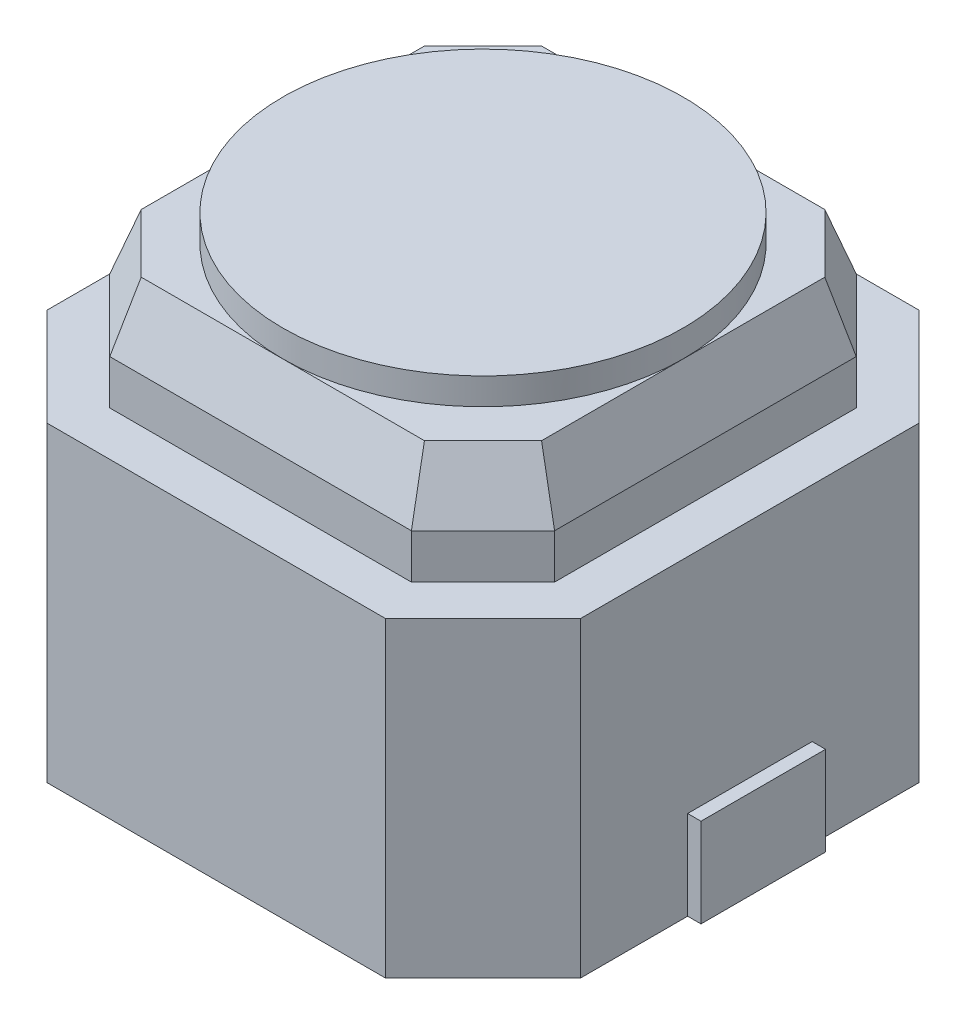
ISO-10303-21;
HEADER;
FILE_DESCRIPTION(('STEP AP214'),'2;1');
FILE_NAME('part.step','',(''),(''),'','','');
FILE_SCHEMA(('AUTOMOTIVE_DESIGN { 1 0 10303 214 1 1 1 1 }'));
ENDSEC;
DATA;
#1=APPLICATION_CONTEXT('core data for automotive mechanical design processes');
#2=APPLICATION_PROTOCOL_DEFINITION('international standard','automotive_design',2000,#1);
#3=PRODUCT_CONTEXT('',#1,'mechanical');
#4=PRODUCT('Part','Part','',(#3));
#5=PRODUCT_RELATED_PRODUCT_CATEGORY('part','',(#4));
#6=PRODUCT_DEFINITION_FORMATION('','',#4);
#7=PRODUCT_DEFINITION_CONTEXT('part definition',#1,'design');
#8=PRODUCT_DEFINITION('design','',#6,#7);
#9=PRODUCT_DEFINITION_SHAPE('','',#8);
#10=(LENGTH_UNIT() NAMED_UNIT(*) SI_UNIT(.MILLI.,.METRE.));
#11=(NAMED_UNIT(*) PLANE_ANGLE_UNIT() SI_UNIT($,.RADIAN.));
#12=(NAMED_UNIT(*) SI_UNIT($,.STERADIAN.) SOLID_ANGLE_UNIT());
#13=UNCERTAINTY_MEASURE_WITH_UNIT(LENGTH_MEASURE(1.E-05),#10,'distance_accuracy_value','');
#14=(GEOMETRIC_REPRESENTATION_CONTEXT(3) GLOBAL_UNCERTAINTY_ASSIGNED_CONTEXT((#13)) GLOBAL_UNIT_ASSIGNED_CONTEXT((#10,
#11,#12)) REPRESENTATION_CONTEXT('',''));
#15=CARTESIAN_POINT('',(0.,0.,0.));
#16=DIRECTION('',(0.,0.,1.));
#17=DIRECTION('',(1.,0.,0.));
#18=AXIS2_PLACEMENT_3D('',#15,#16,#17);
#19=CARTESIAN_POINT('',(0.,3.5,-4.90246392100625));
#20=DIRECTION('',(1.,0.,0.));
#21=DIRECTION('',(0.,0.,-1.));
#22=AXIS2_PLACEMENT_3D('',#19,#20,#21);
#23=PLANE('',#22);
#24=DIRECTION('',(0.,-1.,0.));
#25=VECTOR('',#24,1.);
#26=CARTESIAN_POINT('',(0.,1.,-3.7));
#27=LINE('',#26,#25);
#28=CARTESIAN_POINT('',(0.,1.,-3.7));
#29=VERTEX_POINT('',#28);
#30=CARTESIAN_POINT('',(0.,0.,-3.7));
#31=VERTEX_POINT('',#30);
#32=EDGE_CURVE('E282',#29,#31,#27,.T.);
#33=ORIENTED_EDGE('',*,*,#32,.F.);
#34=DIRECTION('',(0.,0.,1.));
#35=VECTOR('',#34,1.);
#36=CARTESIAN_POINT('',(0.,1.,-3.7));
#37=LINE('',#36,#35);
#38=CARTESIAN_POINT('',(0.,1.,-2.3));
#39=VERTEX_POINT('',#38);
#40=EDGE_CURVE('E275',#29,#39,#37,.T.);
#41=ORIENTED_EDGE('',*,*,#40,.T.);
#42=DIRECTION('',(0.,-1.,0.));
#43=VECTOR('',#42,1.);
#44=CARTESIAN_POINT('',(0.,1.,-2.3));
#45=LINE('',#44,#43);
#46=CARTESIAN_POINT('',(0.,0.,-2.3));
#47=VERTEX_POINT('',#46);
#48=EDGE_CURVE('E261',#39,#47,#45,.T.);
#49=ORIENTED_EDGE('',*,*,#48,.T.);
#50=DIRECTION('',(0.,0.,1.));
#51=VECTOR('',#50,1.);
#52=CARTESIAN_POINT('',(0.,0.,-4.90246392100625));
#53=LINE('',#52,#51);
#54=CARTESIAN_POINT('',(0.,0.,-1.09753607899375));
#55=VERTEX_POINT('',#54);
#56=EDGE_CURVE('E879',#47,#55,#53,.T.);
#57=ORIENTED_EDGE('',*,*,#56,.T.);
#58=DIRECTION('',(0.,-1.,0.));
#59=VECTOR('',#58,1.);
#60=CARTESIAN_POINT('',(0.,3.5,-1.09753607899375));
#61=LINE('',#60,#59);
#62=CARTESIAN_POINT('',(0.,3.5,-1.09753607899375));
#63=VERTEX_POINT('',#62);
#64=EDGE_CURVE('E885',#63,#55,#61,.T.);
#65=ORIENTED_EDGE('',*,*,#64,.F.);
#66=DIRECTION('',(0.,0.,1.));
#67=VECTOR('',#66,1.);
#68=CARTESIAN_POINT('',(0.,3.5,-4.90246392100625));
#69=LINE('',#68,#67);
#70=CARTESIAN_POINT('',(0.,3.5,-4.90246392100625));
#71=VERTEX_POINT('',#70);
#72=EDGE_CURVE('E884',#71,#63,#69,.T.);
#73=ORIENTED_EDGE('',*,*,#72,.F.);
#74=DIRECTION('',(0.,-1.,0.));
#75=VECTOR('',#74,1.);
#76=CARTESIAN_POINT('',(0.,3.5,-4.90246392100625));
#77=LINE('',#76,#75);
#78=CARTESIAN_POINT('',(0.,0.,-4.90246392100625));
#79=VERTEX_POINT('',#78);
#80=EDGE_CURVE('E871',#71,#79,#77,.T.);
#81=ORIENTED_EDGE('',*,*,#80,.T.);
#82=EDGE_CURVE('E882',#79,#31,#53,.T.);
#83=ORIENTED_EDGE('',*,*,#82,.T.);
#84=EDGE_LOOP('',(#33,#41,#49,#57,#65,#73,#81,#83));
#85=FACE_BOUND('',#84,.T.);
#86=ADVANCED_FACE('F52',(#85),#23,.F.);
#87=CARTESIAN_POINT('',(6.,3.5,-4.90246392100625));
#88=DIRECTION('',(-1.,0.,0.));
#89=DIRECTION('',(0.,0.,1.));
#90=AXIS2_PLACEMENT_3D('',#87,#88,#89);
#91=PLANE('',#90);
#92=DIRECTION('',(0.,-1.,0.));
#93=VECTOR('',#92,1.);
#94=CARTESIAN_POINT('',(6.,1.,-2.3));
#95=LINE('',#94,#93);
#96=CARTESIAN_POINT('',(6.,1.,-2.3));
#97=VERTEX_POINT('',#96);
#98=CARTESIAN_POINT('',(6.,0.,-2.3));
#99=VERTEX_POINT('',#98);
#100=EDGE_CURVE('E312',#97,#99,#95,.T.);
#101=ORIENTED_EDGE('',*,*,#100,.F.);
#102=DIRECTION('',(0.,0.,-1.));
#103=VECTOR('',#102,1.);
#104=CARTESIAN_POINT('',(6.,1.,-3.));
#105=LINE('',#104,#103);
#106=CARTESIAN_POINT('',(6.,1.,-3.7));
#107=VERTEX_POINT('',#106);
#108=EDGE_CURVE('E302',#97,#107,#105,.T.);
#109=ORIENTED_EDGE('',*,*,#108,.T.);
#110=DIRECTION('',(0.,-1.,0.));
#111=VECTOR('',#110,1.);
#112=CARTESIAN_POINT('',(6.,1.,-3.7));
#113=LINE('',#112,#111);
#114=CARTESIAN_POINT('',(6.,0.,-3.7));
#115=VERTEX_POINT('',#114);
#116=EDGE_CURVE('E323',#107,#115,#113,.T.);
#117=ORIENTED_EDGE('',*,*,#116,.T.);
#118=DIRECTION('',(0.,0.,-1.));
#119=VECTOR('',#118,1.);
#120=CARTESIAN_POINT('',(6.,0.,-4.90246392100625));
#121=LINE('',#120,#119);
#122=CARTESIAN_POINT('',(6.,0.,-4.90246392100625));
#123=VERTEX_POINT('',#122);
#124=EDGE_CURVE('E898',#115,#123,#121,.T.);
#125=ORIENTED_EDGE('',*,*,#124,.T.);
#126=DIRECTION('',(0.,-1.,0.));
#127=VECTOR('',#126,1.);
#128=CARTESIAN_POINT('',(6.,3.5,-4.90246392100625));
#129=LINE('',#128,#127);
#130=CARTESIAN_POINT('',(6.,3.5,-4.90246392100625));
#131=VERTEX_POINT('',#130);
#132=EDGE_CURVE('E905',#131,#123,#129,.T.);
#133=ORIENTED_EDGE('',*,*,#132,.F.);
#134=DIRECTION('',(0.,0.,-1.));
#135=VECTOR('',#134,1.);
#136=CARTESIAN_POINT('',(6.,3.5,-4.90246392100625));
#137=LINE('',#136,#135);
#138=CARTESIAN_POINT('',(6.,3.5,-1.09753607899375));
#139=VERTEX_POINT('',#138);
#140=EDGE_CURVE('E909',#139,#131,#137,.T.);
#141=ORIENTED_EDGE('',*,*,#140,.F.);
#142=DIRECTION('',(0.,-1.,0.));
#143=VECTOR('',#142,1.);
#144=CARTESIAN_POINT('',(6.,3.5,-1.09753607899375));
#145=LINE('',#144,#143);
#146=CARTESIAN_POINT('',(6.,0.,-1.09753607899375));
#147=VERTEX_POINT('',#146);
#148=EDGE_CURVE('E908',#139,#147,#145,.T.);
#149=ORIENTED_EDGE('',*,*,#148,.T.);
#150=EDGE_CURVE('E899',#147,#99,#121,.T.);
#151=ORIENTED_EDGE('',*,*,#150,.T.);
#152=EDGE_LOOP('',(#101,#109,#117,#125,#133,#141,#149,#151));
#153=FACE_BOUND('',#152,.T.);
#154=ADVANCED_FACE('F846',(#153),#91,.F.);
#155=CARTESIAN_POINT('',(0.,3.5,0.));
#156=DIRECTION('',(0.,-1.,0.));
#157=DIRECTION('',(0.,0.,-1.));
#158=AXIS2_PLACEMENT_3D('',#155,#156,#157);
#159=PLANE('',#158);
#160=DIRECTION('',(-0.707106781186548,0.,-0.707106781186548));
#161=VECTOR('',#160,1.);
#162=CARTESIAN_POINT('',(5.45,3.5,-5.45246392100625));
#163=LINE('',#162,#161);
#164=CARTESIAN_POINT('',(4.90246392100625,3.5,-6.));
#165=VERTEX_POINT('',#164);
#166=EDGE_CURVE('E904',#131,#165,#163,.T.);
#167=ORIENTED_EDGE('',*,*,#166,.T.);
#168=DIRECTION('',(-1.,0.,0.));
#169=VECTOR('',#168,1.);
#170=CARTESIAN_POINT('',(4.90246392100625,3.5,-6.));
#171=LINE('',#170,#169);
#172=CARTESIAN_POINT('',(1.09753607899375,3.5,-6.));
#173=VERTEX_POINT('',#172);
#174=EDGE_CURVE('E922',#165,#173,#171,.T.);
#175=ORIENTED_EDGE('',*,*,#174,.T.);
#176=DIRECTION('',(-0.707106781186548,0.,0.707106781186547));
#177=VECTOR('',#176,1.);
#178=CARTESIAN_POINT('',(0.549999999999998,3.5,-5.45246392100625));
#179=LINE('',#178,#177);
#180=EDGE_CURVE('E939',#173,#71,#179,.T.);
#181=ORIENTED_EDGE('',*,*,#180,.T.);
#182=ORIENTED_EDGE('',*,*,#72,.T.);
#183=DIRECTION('',(0.707106781186548,0.,0.707106781186547));
#184=VECTOR('',#183,1.);
#185=CARTESIAN_POINT('',(0.549999999999998,3.5,-0.547536078993751));
#186=LINE('',#185,#184);
#187=CARTESIAN_POINT('',(1.09753607899375,3.5,0.));
#188=VERTEX_POINT('',#187);
#189=EDGE_CURVE('E936',#63,#188,#186,.T.);
#190=ORIENTED_EDGE('',*,*,#189,.T.);
#191=DIRECTION('',(1.,0.,0.));
#192=VECTOR('',#191,1.);
#193=CARTESIAN_POINT('',(1.09753607899375,3.5,0.));
#194=LINE('',#193,#192);
#195=CARTESIAN_POINT('',(4.90246392100625,3.5,0.));
#196=VERTEX_POINT('',#195);
#197=EDGE_CURVE('E934',#188,#196,#194,.T.);
#198=ORIENTED_EDGE('',*,*,#197,.T.);
#199=DIRECTION('',(0.707106781186548,0.,-0.707106781186548));
#200=VECTOR('',#199,1.);
#201=CARTESIAN_POINT('',(5.45,3.5,-0.54753607899375));
#202=LINE('',#201,#200);
#203=EDGE_CURVE('E932',#196,#139,#202,.T.);
#204=ORIENTED_EDGE('',*,*,#203,.T.);
#205=ORIENTED_EDGE('',*,*,#140,.T.);
#206=EDGE_LOOP('',(#167,#175,#181,#182,#190,#198,#204,#205));
#207=FACE_BOUND('',#206,.T.);
#208=DIRECTION('',(-0.707106781186548,0.,0.707106781186548));
#209=VECTOR('',#208,1.);
#210=CARTESIAN_POINT('',(0.5,3.5,-4.6953571398197));
#211=LINE('',#210,#209);
#212=CARTESIAN_POINT('',(1.3046428601803,3.5,-5.5));
#213=VERTEX_POINT('',#212);
#214=CARTESIAN_POINT('',(0.5,3.5,-4.6953571398197));
#215=VERTEX_POINT('',#214);
#216=EDGE_CURVE('E392',#213,#215,#211,.T.);
#217=ORIENTED_EDGE('',*,*,#216,.F.);
#218=DIRECTION('',(-1.,0.,0.));
#219=VECTOR('',#218,1.);
#220=CARTESIAN_POINT('',(1.3046428601803,3.5,-5.5));
#221=LINE('',#220,#219);
#222=CARTESIAN_POINT('',(4.6953571398197,3.5,-5.5));
#223=VERTEX_POINT('',#222);
#224=EDGE_CURVE('E943',#223,#213,#221,.T.);
#225=ORIENTED_EDGE('',*,*,#224,.F.);
#226=DIRECTION('',(-0.707106781186547,0.,-0.707106781186547));
#227=VECTOR('',#226,1.);
#228=CARTESIAN_POINT('',(4.6953571398197,3.5,-5.5));
#229=LINE('',#228,#227);
#230=CARTESIAN_POINT('',(5.5,3.5,-4.6953571398197));
#231=VERTEX_POINT('',#230);
#232=EDGE_CURVE('E946',#231,#223,#229,.T.);
#233=ORIENTED_EDGE('',*,*,#232,.F.);
#234=DIRECTION('',(0.,0.,-1.));
#235=VECTOR('',#234,1.);
#236=CARTESIAN_POINT('',(5.5,3.5,-4.6953571398197));
#237=LINE('',#236,#235);
#238=CARTESIAN_POINT('',(5.5,3.5,-1.3046428601803));
#239=VERTEX_POINT('',#238);
#240=EDGE_CURVE('E949',#239,#231,#237,.T.);
#241=ORIENTED_EDGE('',*,*,#240,.F.);
#242=DIRECTION('',(0.707106781186547,0.,-0.707106781186547));
#243=VECTOR('',#242,1.);
#244=CARTESIAN_POINT('',(5.5,3.5,-1.3046428601803));
#245=LINE('',#244,#243);
#246=CARTESIAN_POINT('',(4.6953571398197,3.5,-0.499999999999999));
#247=VERTEX_POINT('',#246);
#248=EDGE_CURVE('E952',#247,#239,#245,.T.);
#249=ORIENTED_EDGE('',*,*,#248,.F.);
#250=DIRECTION('',(1.,0.,0.));
#251=VECTOR('',#250,1.);
#252=CARTESIAN_POINT('',(4.6953571398197,3.5,-0.499999999999999));
#253=LINE('',#252,#251);
#254=CARTESIAN_POINT('',(1.3046428601803,3.5,-0.499999999999999));
#255=VERTEX_POINT('',#254);
#256=EDGE_CURVE('E955',#255,#247,#253,.T.);
#257=ORIENTED_EDGE('',*,*,#256,.F.);
#258=DIRECTION('',(0.707106781186548,0.,0.707106781186548));
#259=VECTOR('',#258,1.);
#260=CARTESIAN_POINT('',(1.3046428601803,3.5,-0.499999999999999));
#261=LINE('',#260,#259);
#262=CARTESIAN_POINT('',(0.5,3.5,-1.3046428601803));
#263=VERTEX_POINT('',#262);
#264=EDGE_CURVE('E958',#263,#255,#261,.T.);
#265=ORIENTED_EDGE('',*,*,#264,.F.);
#266=DIRECTION('',(0.,0.,1.));
#267=VECTOR('',#266,1.);
#268=CARTESIAN_POINT('',(0.5,3.5,-1.3046428601803));
#269=LINE('',#268,#267);
#270=EDGE_CURVE('E960',#215,#263,#269,.T.);
#271=ORIENTED_EDGE('',*,*,#270,.F.);
#272=EDGE_LOOP('',(#217,#225,#233,#241,#249,#257,#265,#271));
#273=FACE_BOUND('',#272,.T.);
#274=ADVANCED_FACE('F611',(#207,#273),#159,.F.);
#275=CARTESIAN_POINT('',(4.90246392100625,3.5,-6.));
#276=DIRECTION('',(0.,0.,1.));
#277=DIRECTION('',(1.,0.,0.));
#278=AXIS2_PLACEMENT_3D('',#275,#276,#277);
#279=PLANE('',#278);
#280=DIRECTION('',(-1.,0.,0.));
#281=VECTOR('',#280,1.);
#282=CARTESIAN_POINT('',(4.90246392100625,0.,-6.));
#283=LINE('',#282,#281);
#284=CARTESIAN_POINT('',(4.90246392100625,0.,-6.));
#285=VERTEX_POINT('',#284);
#286=CARTESIAN_POINT('',(1.09753607899375,0.,-6.));
#287=VERTEX_POINT('',#286);
#288=EDGE_CURVE('E880',#285,#287,#283,.T.);
#289=ORIENTED_EDGE('',*,*,#288,.T.);
#290=DIRECTION('',(0.,-1.,0.));
#291=VECTOR('',#290,1.);
#292=CARTESIAN_POINT('',(1.09753607899375,3.5,-6.));
#293=LINE('',#292,#291);
#294=EDGE_CURVE('E874',#173,#287,#293,.T.);
#295=ORIENTED_EDGE('',*,*,#294,.F.);
#296=ORIENTED_EDGE('',*,*,#174,.F.);
#297=DIRECTION('',(0.,-1.,0.));
#298=VECTOR('',#297,1.);
#299=CARTESIAN_POINT('',(4.90246392100625,3.5,-6.));
#300=LINE('',#299,#298);
#301=EDGE_CURVE('E405',#165,#285,#300,.T.);
#302=ORIENTED_EDGE('',*,*,#301,.T.);
#303=EDGE_LOOP('',(#289,#295,#296,#302));
#304=FACE_BOUND('',#303,.T.);
#305=ADVANCED_FACE('F54',(#304),#279,.F.);
#306=CARTESIAN_POINT('',(0.549999999999998,3.5,-5.45246392100625));
#307=DIRECTION('',(0.707106781186547,0.,0.707106781186548));
#308=DIRECTION('',(0.707106781186548,0.,-0.707106781186547));
#309=AXIS2_PLACEMENT_3D('',#306,#307,#308);
#310=PLANE('',#309);
#311=DIRECTION('',(-0.707106781186548,0.,0.707106781186547));
#312=VECTOR('',#311,1.);
#313=CARTESIAN_POINT('',(0.549999999999998,0.,-5.45246392100625));
#314=LINE('',#313,#312);
#315=EDGE_CURVE('E868',#287,#79,#314,.T.);
#316=ORIENTED_EDGE('',*,*,#315,.T.);
#317=ORIENTED_EDGE('',*,*,#80,.F.);
#318=ORIENTED_EDGE('',*,*,#180,.F.);
#319=ORIENTED_EDGE('',*,*,#294,.T.);
#320=EDGE_LOOP('',(#316,#317,#318,#319));
#321=FACE_BOUND('',#320,.T.);
#322=ADVANCED_FACE('F856',(#321),#310,.F.);
#323=CARTESIAN_POINT('',(0.549999999999998,3.5,-0.547536078993751));
#324=DIRECTION('',(0.707106781186547,0.,-0.707106781186548));
#325=DIRECTION('',(-0.707106781186548,0.,-0.707106781186547));
#326=AXIS2_PLACEMENT_3D('',#323,#324,#325);
#327=PLANE('',#326);
#328=DIRECTION('',(0.707106781186548,0.,0.707106781186547));
#329=VECTOR('',#328,1.);
#330=CARTESIAN_POINT('',(0.549999999999998,0.,-0.547536078993751));
#331=LINE('',#330,#329);
#332=CARTESIAN_POINT('',(1.09753607899375,0.,0.));
#333=VERTEX_POINT('',#332);
#334=EDGE_CURVE('E888',#55,#333,#331,.T.);
#335=ORIENTED_EDGE('',*,*,#334,.T.);
#336=DIRECTION('',(0.,-1.,0.));
#337=VECTOR('',#336,1.);
#338=CARTESIAN_POINT('',(1.09753607899375,3.5,0.));
#339=LINE('',#338,#337);
#340=EDGE_CURVE('E915',#188,#333,#339,.T.);
#341=ORIENTED_EDGE('',*,*,#340,.F.);
#342=ORIENTED_EDGE('',*,*,#189,.F.);
#343=ORIENTED_EDGE('',*,*,#64,.T.);
#344=EDGE_LOOP('',(#335,#341,#342,#343));
#345=FACE_BOUND('',#344,.T.);
#346=ADVANCED_FACE('F854',(#345),#327,.F.);
#347=CARTESIAN_POINT('',(1.09753607899375,3.5,0.));
#348=DIRECTION('',(0.,0.,-1.));
#349=DIRECTION('',(-1.,0.,0.));
#350=AXIS2_PLACEMENT_3D('',#347,#348,#349);
#351=PLANE('',#350);
#352=DIRECTION('',(1.,0.,0.));
#353=VECTOR('',#352,1.);
#354=CARTESIAN_POINT('',(1.09753607899375,0.,0.));
#355=LINE('',#354,#353);
#356=CARTESIAN_POINT('',(4.90246392100625,0.,0.));
#357=VERTEX_POINT('',#356);
#358=EDGE_CURVE('E890',#333,#357,#355,.T.);
#359=ORIENTED_EDGE('',*,*,#358,.T.);
#360=DIRECTION('',(0.,-1.,0.));
#361=VECTOR('',#360,1.);
#362=CARTESIAN_POINT('',(4.90246392100625,3.5,0.));
#363=LINE('',#362,#361);
#364=EDGE_CURVE('E912',#196,#357,#363,.T.);
#365=ORIENTED_EDGE('',*,*,#364,.F.);
#366=ORIENTED_EDGE('',*,*,#197,.F.);
#367=ORIENTED_EDGE('',*,*,#340,.T.);
#368=EDGE_LOOP('',(#359,#365,#366,#367));
#369=FACE_BOUND('',#368,.T.);
#370=ADVANCED_FACE('F863',(#369),#351,.F.);
#371=CARTESIAN_POINT('',(5.45,3.5,-0.54753607899375));
#372=DIRECTION('',(-0.707106781186547,0.,-0.707106781186548));
#373=DIRECTION('',(-0.707106781186548,0.,0.707106781186547));
#374=AXIS2_PLACEMENT_3D('',#371,#372,#373);
#375=PLANE('',#374);
#376=DIRECTION('',(0.707106781186548,0.,-0.707106781186547));
#377=VECTOR('',#376,1.);
#378=CARTESIAN_POINT('',(5.45,0.,-0.54753607899375));
#379=LINE('',#378,#377);
#380=EDGE_CURVE('E896',#357,#147,#379,.T.);
#381=ORIENTED_EDGE('',*,*,#380,.T.);
#382=ORIENTED_EDGE('',*,*,#148,.F.);
#383=ORIENTED_EDGE('',*,*,#203,.F.);
#384=ORIENTED_EDGE('',*,*,#364,.T.);
#385=EDGE_LOOP('',(#381,#382,#383,#384));
#386=FACE_BOUND('',#385,.T.);
#387=ADVANCED_FACE('F1188',(#386),#375,.F.);
#388=CARTESIAN_POINT('',(5.45,3.5,-5.45246392100625));
#389=DIRECTION('',(-0.707106781186547,0.,0.707106781186548));
#390=DIRECTION('',(0.707106781186548,0.,0.707106781186547));
#391=AXIS2_PLACEMENT_3D('',#388,#389,#390);
#392=PLANE('',#391);
#393=DIRECTION('',(-0.707106781186548,0.,-0.707106781186547));
#394=VECTOR('',#393,1.);
#395=CARTESIAN_POINT('',(5.45,0.,-5.45246392100625));
#396=LINE('',#395,#394);
#397=EDGE_CURVE('E902',#123,#285,#396,.T.);
#398=ORIENTED_EDGE('',*,*,#397,.T.);
#399=ORIENTED_EDGE('',*,*,#301,.F.);
#400=ORIENTED_EDGE('',*,*,#166,.F.);
#401=ORIENTED_EDGE('',*,*,#132,.T.);
#402=EDGE_LOOP('',(#398,#399,#400,#401));
#403=FACE_BOUND('',#402,.T.);
#404=ADVANCED_FACE('F925',(#403),#392,.F.);
#405=CARTESIAN_POINT('',(0.,0.,0.));
#406=DIRECTION('',(0.,-1.,0.));
#407=DIRECTION('',(0.,0.,-1.));
#408=AXIS2_PLACEMENT_3D('',#405,#406,#407);
#409=PLANE('',#408);
#410=ORIENTED_EDGE('',*,*,#288,.F.);
#411=ORIENTED_EDGE('',*,*,#397,.F.);
#412=ORIENTED_EDGE('',*,*,#124,.F.);
#413=DIRECTION('',(1.,0.,0.));
#414=VECTOR('',#413,1.);
#415=CARTESIAN_POINT('',(6.15,0.,-3.7));
#416=LINE('',#415,#414);
#417=CARTESIAN_POINT('',(6.15,0.,-3.7));
#418=VERTEX_POINT('',#417);
#419=EDGE_CURVE('E77',#115,#418,#416,.T.);
#420=ORIENTED_EDGE('',*,*,#419,.T.);
#421=DIRECTION('',(0.,0.,1.));
#422=VECTOR('',#421,1.);
#423=CARTESIAN_POINT('',(6.15,0.,-2.3));
#424=LINE('',#423,#422);
#425=CARTESIAN_POINT('',(6.15,0.,-2.3));
#426=VERTEX_POINT('',#425);
#427=EDGE_CURVE('E303',#418,#426,#424,.T.);
#428=ORIENTED_EDGE('',*,*,#427,.T.);
#429=DIRECTION('',(-1.,0.,0.));
#430=VECTOR('',#429,1.);
#431=CARTESIAN_POINT('',(6.,0.,-2.3));
#432=LINE('',#431,#430);
#433=EDGE_CURVE('E295',#426,#99,#432,.T.);
#434=ORIENTED_EDGE('',*,*,#433,.T.);
#435=ORIENTED_EDGE('',*,*,#150,.F.);
#436=ORIENTED_EDGE('',*,*,#380,.F.);
#437=ORIENTED_EDGE('',*,*,#358,.F.);
#438=ORIENTED_EDGE('',*,*,#334,.F.);
#439=ORIENTED_EDGE('',*,*,#56,.F.);
#440=DIRECTION('',(-1.,0.,0.));
#441=VECTOR('',#440,1.);
#442=CARTESIAN_POINT('',(0.,0.,-2.3));
#443=LINE('',#442,#441);
#444=CARTESIAN_POINT('',(-0.15,0.,-2.3));
#445=VERTEX_POINT('',#444);
#446=EDGE_CURVE('E69',#47,#445,#443,.T.);
#447=ORIENTED_EDGE('',*,*,#446,.T.);
#448=DIRECTION('',(0.,0.,-1.));
#449=VECTOR('',#448,1.);
#450=CARTESIAN_POINT('',(-0.15,0.,-2.3));
#451=LINE('',#450,#449);
#452=CARTESIAN_POINT('',(-0.15,0.,-3.7));
#453=VERTEX_POINT('',#452);
#454=EDGE_CURVE('E286',#445,#453,#451,.T.);
#455=ORIENTED_EDGE('',*,*,#454,.T.);
#456=DIRECTION('',(1.,0.,0.));
#457=VECTOR('',#456,1.);
#458=CARTESIAN_POINT('',(-0.15,0.,-3.7));
#459=LINE('',#458,#457);
#460=EDGE_CURVE('E283',#453,#31,#459,.T.);
#461=ORIENTED_EDGE('',*,*,#460,.T.);
#462=ORIENTED_EDGE('',*,*,#82,.F.);
#463=ORIENTED_EDGE('',*,*,#315,.F.);
#464=EDGE_LOOP('',(#410,#411,#412,#420,#428,#434,#435,#436,#437,#438,#439,#447,#455,#461,#462,#463));
#465=FACE_BOUND('',#464,.T.);
#466=ADVANCED_FACE('F609',(#465),#409,.T.);
#467=CARTESIAN_POINT('',(0.5,4.,-4.6953571398197));
#468=DIRECTION('',(0.707106781186547,0.,0.707106781186547));
#469=DIRECTION('',(0.707106781186548,0.,-0.707106781186548));
#470=AXIS2_PLACEMENT_3D('',#467,#468,#469);
#471=PLANE('',#470);
#472=ORIENTED_EDGE('',*,*,#216,.T.);
#473=DIRECTION('',(0.,-1.,0.));
#474=VECTOR('',#473,1.);
#475=CARTESIAN_POINT('',(0.5,4.,-4.6953571398197));
#476=LINE('',#475,#474);
#477=CARTESIAN_POINT('',(0.5,4.,-4.6953571398197));
#478=VERTEX_POINT('',#477);
#479=EDGE_CURVE('E584',#478,#215,#476,.T.);
#480=ORIENTED_EDGE('',*,*,#479,.F.);
#481=CARTESIAN_POINT('',(1.3046428601803,4.,-5.5));
#482=DIRECTION('',(-0.707106781186548,0.,0.707106781186548));
#483=VECTOR('',#482,1.);
#484=LINE('',#481,#483);
#485=CARTESIAN_POINT('',(1.3046428601803,4.,-5.5));
#486=VERTEX_POINT('',#485);
#487=EDGE_CURVE('E803',#486,#478,#484,.T.);
#488=ORIENTED_EDGE('',*,*,#487,.F.);
#489=DIRECTION('',(0.,-1.,0.));
#490=VECTOR('',#489,1.);
#491=CARTESIAN_POINT('',(1.3046428601803,4.,-5.5));
#492=LINE('',#491,#490);
#493=EDGE_CURVE('E450',#486,#213,#492,.T.);
#494=ORIENTED_EDGE('',*,*,#493,.T.);
#495=EDGE_LOOP('',(#472,#480,#488,#494));
#496=FACE_BOUND('',#495,.T.);
#497=ADVANCED_FACE('F605',(#496),#471,.F.);
#498=CARTESIAN_POINT('',(0.5,4.,-1.3046428601803));
#499=DIRECTION('',(1.,0.,0.));
#500=DIRECTION('',(0.,0.,-1.));
#501=AXIS2_PLACEMENT_3D('',#498,#499,#500);
#502=PLANE('',#501);
#503=ORIENTED_EDGE('',*,*,#270,.T.);
#504=DIRECTION('',(0.,-1.,0.));
#505=VECTOR('',#504,1.);
#506=CARTESIAN_POINT('',(0.5,4.,-1.3046428601803));
#507=LINE('',#506,#505);
#508=CARTESIAN_POINT('',(0.5,4.,-1.3046428601803));
#509=VERTEX_POINT('',#508);
#510=EDGE_CURVE('E565',#509,#263,#507,.T.);
#511=ORIENTED_EDGE('',*,*,#510,.F.);
#512=CARTESIAN_POINT('',(0.5,4.,-4.6953571398197));
#513=DIRECTION('',(0.,0.,1.));
#514=VECTOR('',#513,1.);
#515=LINE('',#512,#514);
#516=EDGE_CURVE('E590',#478,#509,#515,.T.);
#517=ORIENTED_EDGE('',*,*,#516,.F.);
#518=ORIENTED_EDGE('',*,*,#479,.T.);
#519=EDGE_LOOP('',(#503,#511,#517,#518));
#520=FACE_BOUND('',#519,.T.);
#521=ADVANCED_FACE('F596',(#520),#502,.F.);
#522=CARTESIAN_POINT('',(1.3046428601803,4.,-0.499999999999999));
#523=DIRECTION('',(0.707106781186547,0.,-0.707106781186547));
#524=DIRECTION('',(-0.707106781186548,0.,-0.707106781186548));
#525=AXIS2_PLACEMENT_3D('',#522,#523,#524);
#526=PLANE('',#525);
#527=ORIENTED_EDGE('',*,*,#264,.T.);
#528=DIRECTION('',(0.,-1.,0.));
#529=VECTOR('',#528,1.);
#530=CARTESIAN_POINT('',(1.3046428601803,4.,-0.499999999999999));
#531=LINE('',#530,#529);
#532=CARTESIAN_POINT('',(1.3046428601803,4.,-0.499999999999999));
#533=VERTEX_POINT('',#532);
#534=EDGE_CURVE('E557',#533,#255,#531,.T.);
#535=ORIENTED_EDGE('',*,*,#534,.F.);
#536=CARTESIAN_POINT('',(0.5,4.,-1.3046428601803));
#537=DIRECTION('',(0.707106781186548,0.,0.707106781186548));
#538=VECTOR('',#537,1.);
#539=LINE('',#536,#538);
#540=EDGE_CURVE('E573',#509,#533,#539,.T.);
#541=ORIENTED_EDGE('',*,*,#540,.F.);
#542=ORIENTED_EDGE('',*,*,#510,.T.);
#543=EDGE_LOOP('',(#527,#535,#541,#542));
#544=FACE_BOUND('',#543,.T.);
#545=ADVANCED_FACE('F547',(#544),#526,.F.);
#546=CARTESIAN_POINT('',(4.6953571398197,4.,-0.499999999999999));
#547=DIRECTION('',(0.,0.,-1.));
#548=DIRECTION('',(-1.,0.,0.));
#549=AXIS2_PLACEMENT_3D('',#546,#547,#548);
#550=PLANE('',#549);
#551=ORIENTED_EDGE('',*,*,#256,.T.);
#552=DIRECTION('',(0.,-1.,0.));
#553=VECTOR('',#552,1.);
#554=CARTESIAN_POINT('',(4.6953571398197,4.,-0.499999999999999));
#555=LINE('',#554,#553);
#556=CARTESIAN_POINT('',(4.6953571398197,4.,-0.499999999999999));
#557=VERTEX_POINT('',#556);
#558=EDGE_CURVE('E521',#557,#247,#555,.T.);
#559=ORIENTED_EDGE('',*,*,#558,.F.);
#560=CARTESIAN_POINT('',(1.3046428601803,4.,-0.499999999999999));
#561=DIRECTION('',(1.,0.,0.));
#562=VECTOR('',#561,1.);
#563=LINE('',#560,#562);
#564=EDGE_CURVE('E965',#533,#557,#563,.T.);
#565=ORIENTED_EDGE('',*,*,#564,.F.);
#566=ORIENTED_EDGE('',*,*,#534,.T.);
#567=EDGE_LOOP('',(#551,#559,#565,#566));
#568=FACE_BOUND('',#567,.T.);
#569=ADVANCED_FACE('F543',(#568),#550,.F.);
#570=CARTESIAN_POINT('',(5.5,4.,-1.3046428601803));
#571=DIRECTION('',(-0.707106781186547,0.,-0.707106781186547));
#572=DIRECTION('',(-0.707106781186548,0.,0.707106781186548));
#573=AXIS2_PLACEMENT_3D('',#570,#571,#572);
#574=PLANE('',#573);
#575=ORIENTED_EDGE('',*,*,#248,.T.);
#576=DIRECTION('',(0.,-1.,0.));
#577=VECTOR('',#576,1.);
#578=CARTESIAN_POINT('',(5.5,4.,-1.3046428601803));
#579=LINE('',#578,#577);
#580=CARTESIAN_POINT('',(5.5,4.,-1.3046428601803));
#581=VERTEX_POINT('',#580);
#582=EDGE_CURVE('E502',#581,#239,#579,.T.);
#583=ORIENTED_EDGE('',*,*,#582,.F.);
#584=CARTESIAN_POINT('',(4.6953571398197,4.,-0.5));
#585=DIRECTION('',(0.707106781186547,0.,-0.707106781186548));
#586=VECTOR('',#585,1.);
#587=LINE('',#584,#586);
#588=EDGE_CURVE('E528',#557,#581,#587,.T.);
#589=ORIENTED_EDGE('',*,*,#588,.F.);
#590=ORIENTED_EDGE('',*,*,#558,.T.);
#591=EDGE_LOOP('',(#575,#583,#589,#590));
#592=FACE_BOUND('',#591,.T.);
#593=ADVANCED_FACE('F534',(#592),#574,.F.);
#594=CARTESIAN_POINT('',(5.5,4.,-4.6953571398197));
#595=DIRECTION('',(-1.,0.,0.));
#596=DIRECTION('',(0.,0.,1.));
#597=AXIS2_PLACEMENT_3D('',#594,#595,#596);
#598=PLANE('',#597);
#599=ORIENTED_EDGE('',*,*,#240,.T.);
#600=DIRECTION('',(0.,-1.,0.));
#601=VECTOR('',#600,1.);
#602=CARTESIAN_POINT('',(5.5,4.,-4.6953571398197));
#603=LINE('',#602,#601);
#604=CARTESIAN_POINT('',(5.5,4.,-4.6953571398197));
#605=VERTEX_POINT('',#604);
#606=EDGE_CURVE('E494',#605,#231,#603,.T.);
#607=ORIENTED_EDGE('',*,*,#606,.F.);
#608=CARTESIAN_POINT('',(5.5,4.,-1.3046428601803));
#609=DIRECTION('',(0.,0.,-1.));
#610=VECTOR('',#609,1.);
#611=LINE('',#608,#610);
#612=EDGE_CURVE('E510',#581,#605,#611,.T.);
#613=ORIENTED_EDGE('',*,*,#612,.F.);
#614=ORIENTED_EDGE('',*,*,#582,.T.);
#615=EDGE_LOOP('',(#599,#607,#613,#614));
#616=FACE_BOUND('',#615,.T.);
#617=ADVANCED_FACE('F484',(#616),#598,.F.);
#618=CARTESIAN_POINT('',(4.6953571398197,4.,-5.5));
#619=DIRECTION('',(-0.707106781186547,0.,0.707106781186547));
#620=DIRECTION('',(0.707106781186548,0.,0.707106781186548));
#621=AXIS2_PLACEMENT_3D('',#618,#619,#620);
#622=PLANE('',#621);
#623=ORIENTED_EDGE('',*,*,#232,.T.);
#624=DIRECTION('',(0.,-1.,0.));
#625=VECTOR('',#624,1.);
#626=CARTESIAN_POINT('',(4.6953571398197,4.,-5.5));
#627=LINE('',#626,#625);
#628=CARTESIAN_POINT('',(4.6953571398197,4.,-5.5));
#629=VERTEX_POINT('',#628);
#630=EDGE_CURVE('E458',#629,#223,#627,.T.);
#631=ORIENTED_EDGE('',*,*,#630,.F.);
#632=CARTESIAN_POINT('',(5.5,4.,-4.6953571398197));
#633=DIRECTION('',(-0.707106781186547,0.,-0.707106781186547));
#634=VECTOR('',#633,1.);
#635=LINE('',#632,#634);
#636=EDGE_CURVE('E964',#605,#629,#635,.T.);
#637=ORIENTED_EDGE('',*,*,#636,.F.);
#638=ORIENTED_EDGE('',*,*,#606,.T.);
#639=EDGE_LOOP('',(#623,#631,#637,#638));
#640=FACE_BOUND('',#639,.T.);
#641=ADVANCED_FACE('F480',(#640),#622,.F.);
#642=CARTESIAN_POINT('',(1.3046428601803,4.,-5.5));
#643=DIRECTION('',(0.,0.,1.));
#644=DIRECTION('',(1.,0.,0.));
#645=AXIS2_PLACEMENT_3D('',#642,#643,#644);
#646=PLANE('',#645);
#647=ORIENTED_EDGE('',*,*,#224,.T.);
#648=ORIENTED_EDGE('',*,*,#493,.F.);
#649=CARTESIAN_POINT('',(4.6953571398197,4.,-5.5));
#650=DIRECTION('',(-1.,0.,0.));
#651=VECTOR('',#650,1.);
#652=LINE('',#649,#651);
#653=EDGE_CURVE('E459',#629,#486,#652,.T.);
#654=ORIENTED_EDGE('',*,*,#653,.F.);
#655=ORIENTED_EDGE('',*,*,#630,.T.);
#656=EDGE_LOOP('',(#647,#648,#654,#655));
#657=FACE_BOUND('',#656,.T.);
#658=ADVANCED_FACE('F349',(#657),#646,.F.);
#659=CARTESIAN_POINT('',(0.,2.19457013574661,-6.1447963800905));
#660=DIRECTION('',(0.,0.336336396998156,-0.941741911594837));
#661=DIRECTION('',(0.,0.941741911594838,0.336336396998157));
#662=AXIS2_PLACEMENT_3D('',#659,#660,#661);
#663=PLANE('',#662);
#664=CARTESIAN_POINT('',(4.59180374922643,4.7,-5.25));
#665=DIRECTION('',(0.137982501831481,-0.932733836416845,-0.333119227291732));
#666=VECTOR('',#665,1.);
#667=LINE('',#664,#666);
#668=CARTESIAN_POINT('',(4.59180374922643,4.7,-5.25));
#669=VERTEX_POINT('',#668);
#670=EDGE_CURVE('E673',#669,#629,#667,.T.);
#671=ORIENTED_EDGE('',*,*,#670,.T.);
#672=ORIENTED_EDGE('',*,*,#653,.T.);
#673=CARTESIAN_POINT('',(1.40819625077357,4.7,-5.25));
#674=DIRECTION('',(-0.13798250183148,-0.932733836416845,-0.333119227291731));
#675=VECTOR('',#674,1.);
#676=LINE('',#673,#675);
#677=CARTESIAN_POINT('',(1.40819625077357,4.7,-5.25));
#678=VERTEX_POINT('',#677);
#679=EDGE_CURVE('E330',#678,#486,#676,.T.);
#680=ORIENTED_EDGE('',*,*,#679,.F.);
#681=DIRECTION('',(-1.,0.,0.));
#682=VECTOR('',#681,1.);
#683=CARTESIAN_POINT('',(4.59180374922643,4.7,-5.25));
#684=LINE('',#683,#682);
#685=CARTESIAN_POINT('',(2.99839820544015,4.7,-5.25));
#686=VERTEX_POINT('',#685);
#687=EDGE_CURVE('E644',#686,#678,#684,.T.);
#688=ORIENTED_EDGE('',*,*,#687,.F.);
#689=CARTESIAN_POINT('',(3.,4.7,-3.));
#690=DIRECTION('',(0.,1.,0.));
#691=DIRECTION('',(0.,0.,-1.));
#692=AXIS2_PLACEMENT_3D('',#689,#690,#691);
#693=CIRCLE('',#692,2.25);
#694=CARTESIAN_POINT('',(3.,4.7,-5.25));
#695=VERTEX_POINT('',#694);
#696=EDGE_CURVE('E383',#695,#686,#693,.T.);
#697=ORIENTED_EDGE('',*,*,#696,.F.);
#698=DIRECTION('',(1.,0.,0.));
#699=VECTOR('',#698,1.);
#700=CARTESIAN_POINT('',(0.,4.7,-5.25));
#701=LINE('',#700,#699);
#702=EDGE_CURVE('E668',#669,#695,#701,.F.);
#703=ORIENTED_EDGE('',*,*,#702,.F.);
#704=EDGE_LOOP('',(#671,#672,#680,#688,#697,#703));
#705=FACE_BOUND('',#704,.T.);
#706=ADVANCED_FACE('F338',(#705),#663,.T.);
#707=CARTESIAN_POINT('',(-2.75626650875368,1.39212481364079,-2.75626650875368));
#708=DIRECTION('',(-0.665912091816292,0.336336396998156,-0.665912091816292));
#709=DIRECTION('',(-0.707106781186548,0.,0.707106781186548));
#710=AXIS2_PLACEMENT_3D('',#707,#708,#709);
#711=PLANE('',#710);
#712=ORIENTED_EDGE('',*,*,#679,.T.);
#713=ORIENTED_EDGE('',*,*,#487,.T.);
#714=CARTESIAN_POINT('',(0.75,4.7,-4.59180374922643));
#715=DIRECTION('',(-0.333119227291731,-0.932733836416845,-0.137982501831481));
#716=VECTOR('',#715,1.);
#717=LINE('',#714,#716);
#718=CARTESIAN_POINT('',(0.75,4.7,-4.59180374922643));
#719=VERTEX_POINT('',#718);
#720=EDGE_CURVE('E831',#719,#478,#717,.T.);
#721=ORIENTED_EDGE('',*,*,#720,.F.);
#722=DIRECTION('',(-0.707106781186548,0.,0.707106781186547));
#723=VECTOR('',#722,1.);
#724=CARTESIAN_POINT('',(1.40819625077357,4.7,-5.25));
#725=LINE('',#724,#723);
#726=EDGE_CURVE('E665',#678,#719,#725,.T.);
#727=ORIENTED_EDGE('',*,*,#726,.F.);
#728=EDGE_LOOP('',(#712,#713,#721,#727));
#729=FACE_BOUND('',#728,.T.);
#730=ADVANCED_FACE('F348',(#729),#711,.T.);
#731=CARTESIAN_POINT('',(5.41689999291658,2.73594765571477,-5.41689999291658));
#732=DIRECTION('',(0.665912091816292,0.336336396998157,-0.665912091816292));
#733=DIRECTION('',(-0.707106781186547,0.,-0.707106781186547));
#734=AXIS2_PLACEMENT_3D('',#731,#732,#733);
#735=PLANE('',#734);
#736=CARTESIAN_POINT('',(5.25,4.7,-4.59180374922643));
#737=DIRECTION('',(0.333119227291731,-0.932733836416845,-0.137982501831481));
#738=VECTOR('',#737,1.);
#739=LINE('',#736,#738);
#740=CARTESIAN_POINT('',(5.25,4.7,-4.59180374922643));
#741=VERTEX_POINT('',#740);
#742=EDGE_CURVE('E688',#741,#605,#739,.T.);
#743=ORIENTED_EDGE('',*,*,#742,.T.);
#744=ORIENTED_EDGE('',*,*,#636,.T.);
#745=ORIENTED_EDGE('',*,*,#670,.F.);
#746=DIRECTION('',(-0.707106781186547,0.,-0.707106781186547));
#747=VECTOR('',#746,1.);
#748=CARTESIAN_POINT('',(5.25,4.7,-4.59180374922643));
#749=LINE('',#748,#747);
#750=EDGE_CURVE('E388',#741,#669,#749,.T.);
#751=ORIENTED_EDGE('',*,*,#750,.F.);
#752=EDGE_LOOP('',(#743,#744,#745,#751));
#753=FACE_BOUND('',#752,.T.);
#754=ADVANCED_FACE('F687',(#753),#735,.T.);
#755=CARTESIAN_POINT('',(6.1447963800905,2.19457013574661,0.));
#756=DIRECTION('',(0.941741911594837,0.336336396998156,0.));
#757=DIRECTION('',(-0.336336396998157,0.941741911594838,0.));
#758=AXIS2_PLACEMENT_3D('',#755,#756,#757);
#759=PLANE('',#758);
#760=CARTESIAN_POINT('',(5.25,4.7,-1.40819625077357));
#761=DIRECTION('',(0.333119227291731,-0.932733836416845,0.13798250183148));
#762=VECTOR('',#761,1.);
#763=LINE('',#760,#762);
#764=CARTESIAN_POINT('',(5.25,4.7,-1.40819625077357));
#765=VERTEX_POINT('',#764);
#766=EDGE_CURVE('E696',#765,#581,#763,.T.);
#767=ORIENTED_EDGE('',*,*,#766,.T.);
#768=ORIENTED_EDGE('',*,*,#612,.T.);
#769=ORIENTED_EDGE('',*,*,#742,.F.);
#770=DIRECTION('',(0.,0.,-1.));
#771=VECTOR('',#770,1.);
#772=CARTESIAN_POINT('',(5.25,4.7,-1.40819625077357));
#773=LINE('',#772,#771);
#774=CARTESIAN_POINT('',(5.25,4.7,-3.00160179455831));
#775=VERTEX_POINT('',#774);
#776=EDGE_CURVE('E641',#775,#741,#773,.T.);
#777=ORIENTED_EDGE('',*,*,#776,.F.);
#778=CARTESIAN_POINT('',(3.,4.7,-3.));
#779=DIRECTION('',(0.,1.,0.));
#780=DIRECTION('',(1.,0.,0.));
#781=AXIS2_PLACEMENT_3D('',#778,#779,#780);
#782=CIRCLE('',#781,2.25);
#783=CARTESIAN_POINT('',(5.25,4.7,-3.));
#784=VERTEX_POINT('',#783);
#785=EDGE_CURVE('E650',#784,#775,#782,.T.);
#786=ORIENTED_EDGE('',*,*,#785,.F.);
#787=DIRECTION('',(0.,0.,1.));
#788=VECTOR('',#787,1.);
#789=CARTESIAN_POINT('',(5.25,4.7,0.));
#790=LINE('',#789,#788);
#791=EDGE_CURVE('E647',#765,#784,#790,.F.);
#792=ORIENTED_EDGE('',*,*,#791,.F.);
#793=EDGE_LOOP('',(#767,#768,#769,#777,#786,#792));
#794=FACE_BOUND('',#793,.T.);
#795=ADVANCED_FACE('F694',(#794),#759,.T.);
#796=CARTESIAN_POINT('',(2.75626650875368,1.39212481364079,2.75626650875368));
#797=DIRECTION('',(0.665912091816292,0.336336396998156,0.665912091816292));
#798=DIRECTION('',(0.707106781186548,0.,-0.707106781186548));
#799=AXIS2_PLACEMENT_3D('',#796,#797,#798);
#800=PLANE('',#799);
#801=CARTESIAN_POINT('',(4.59180374922643,4.7,-0.75));
#802=DIRECTION('',(0.137982501831481,-0.932733836416845,0.33311922729173));
#803=VECTOR('',#802,1.);
#804=LINE('',#801,#803);
#805=CARTESIAN_POINT('',(4.59180374922643,4.7,-0.749999999999999));
#806=VERTEX_POINT('',#805);
#807=EDGE_CURVE('E743',#806,#557,#804,.T.);
#808=ORIENTED_EDGE('',*,*,#807,.T.);
#809=ORIENTED_EDGE('',*,*,#588,.T.);
#810=ORIENTED_EDGE('',*,*,#766,.F.);
#811=DIRECTION('',(0.707106781186548,0.,-0.707106781186547));
#812=VECTOR('',#811,1.);
#813=CARTESIAN_POINT('',(4.59180374922643,4.7,-0.749999999999999));
#814=LINE('',#813,#812);
#815=EDGE_CURVE('E638',#806,#765,#814,.T.);
#816=ORIENTED_EDGE('',*,*,#815,.F.);
#817=EDGE_LOOP('',(#808,#809,#810,#816));
#818=FACE_BOUND('',#817,.T.);
#819=ADVANCED_FACE('F713',(#818),#800,.T.);
#820=CARTESIAN_POINT('',(0.,0.294117647058824,0.823529411764707));
#821=DIRECTION('',(0.,0.336336396998156,0.941741911594837));
#822=DIRECTION('',(0.,-0.941741911594837,0.336336396998156));
#823=AXIS2_PLACEMENT_3D('',#820,#821,#822);
#824=PLANE('',#823);
#825=CARTESIAN_POINT('',(1.40819625077357,4.7,-0.749999999999999));
#826=DIRECTION('',(-0.137982501831481,-0.932733836416845,0.33311922729173));
#827=VECTOR('',#826,1.);
#828=LINE('',#825,#827);
#829=CARTESIAN_POINT('',(1.40819625077357,4.7,-0.749999999999999));
#830=VERTEX_POINT('',#829);
#831=EDGE_CURVE('E835',#830,#533,#828,.T.);
#832=ORIENTED_EDGE('',*,*,#831,.T.);
#833=ORIENTED_EDGE('',*,*,#564,.T.);
#834=ORIENTED_EDGE('',*,*,#807,.F.);
#835=DIRECTION('',(1.,0.,0.));
#836=VECTOR('',#835,1.);
#837=CARTESIAN_POINT('',(1.40819625077357,4.7,-0.749999999999999));
#838=LINE('',#837,#836);
#839=CARTESIAN_POINT('',(3.00160179455835,4.7,-0.749999999999999));
#840=VERTEX_POINT('',#839);
#841=EDGE_CURVE('E625',#840,#806,#838,.T.);
#842=ORIENTED_EDGE('',*,*,#841,.F.);
#843=CARTESIAN_POINT('',(3.,4.7,-3.));
#844=DIRECTION('',(0.,1.,0.));
#845=DIRECTION('',(0.,0.,1.));
#846=AXIS2_PLACEMENT_3D('',#843,#844,#845);
#847=CIRCLE('',#846,2.25);
#848=CARTESIAN_POINT('',(3.,4.7,-0.749999999999999));
#849=VERTEX_POINT('',#848);
#850=EDGE_CURVE('E631',#849,#840,#847,.T.);
#851=ORIENTED_EDGE('',*,*,#850,.F.);
#852=DIRECTION('',(1.,0.,0.));
#853=VECTOR('',#852,1.);
#854=CARTESIAN_POINT('',(0.,4.7,-0.749999999999999));
#855=LINE('',#854,#853);
#856=EDGE_CURVE('E635',#830,#849,#855,.T.);
#857=ORIENTED_EDGE('',*,*,#856,.F.);
#858=EDGE_LOOP('',(#832,#833,#834,#842,#851,#857));
#859=FACE_BOUND('',#858,.T.);
#860=ADVANCED_FACE('F759',(#859),#824,.T.);
#861=CARTESIAN_POINT('',(-0.0956330245907878,0.0483019715668042,0.0956330245907878));
#862=DIRECTION('',(-0.665912091816292,0.336336396998156,0.665912091816292));
#863=DIRECTION('',(0.707106781186548,0.,0.707106781186548));
#864=AXIS2_PLACEMENT_3D('',#861,#862,#863);
#865=PLANE('',#864);
#866=CARTESIAN_POINT('',(0.75,4.7,-1.40819625077357));
#867=DIRECTION('',(-0.33311922729173,-0.932733836416845,0.137982501831481));
#868=VECTOR('',#867,1.);
#869=LINE('',#866,#868);
#870=CARTESIAN_POINT('',(0.75,4.7,-1.40819625077357));
#871=VERTEX_POINT('',#870);
#872=EDGE_CURVE('E833',#871,#509,#869,.T.);
#873=ORIENTED_EDGE('',*,*,#872,.T.);
#874=ORIENTED_EDGE('',*,*,#540,.T.);
#875=ORIENTED_EDGE('',*,*,#831,.F.);
#876=DIRECTION('',(0.707106781186548,0.,0.707106781186548));
#877=VECTOR('',#876,1.);
#878=CARTESIAN_POINT('',(0.75,4.7,-1.40819625077357));
#879=LINE('',#878,#877);
#880=EDGE_CURVE('E628',#871,#830,#879,.T.);
#881=ORIENTED_EDGE('',*,*,#880,.F.);
#882=EDGE_LOOP('',(#873,#874,#875,#881));
#883=FACE_BOUND('',#882,.T.);
#884=ADVANCED_FACE('F768',(#883),#865,.T.);
#885=CARTESIAN_POINT('',(-0.823529411764706,0.294117647058823,0.));
#886=DIRECTION('',(-0.941741911594837,0.336336396998156,0.));
#887=DIRECTION('',(-0.336336396998156,-0.941741911594837,0.));
#888=AXIS2_PLACEMENT_3D('',#885,#886,#887);
#889=PLANE('',#888);
#890=ORIENTED_EDGE('',*,*,#720,.T.);
#891=ORIENTED_EDGE('',*,*,#516,.T.);
#892=ORIENTED_EDGE('',*,*,#872,.F.);
#893=DIRECTION('',(0.,0.,1.));
#894=VECTOR('',#893,1.);
#895=CARTESIAN_POINT('',(0.75,4.7,-4.59180374922643));
#896=LINE('',#895,#894);
#897=CARTESIAN_POINT('',(0.750000570165807,4.7,-2.99839820544048));
#898=VERTEX_POINT('',#897);
#899=EDGE_CURVE('E320',#898,#871,#896,.T.);
#900=ORIENTED_EDGE('',*,*,#899,.F.);
#901=CARTESIAN_POINT('',(3.,4.7,-3.));
#902=DIRECTION('',(0.,1.,0.));
#903=DIRECTION('',(-1.,0.,0.));
#904=AXIS2_PLACEMENT_3D('',#901,#902,#903);
#905=CIRCLE('',#904,2.25);
#906=CARTESIAN_POINT('',(0.75,4.7,-3.));
#907=VERTEX_POINT('',#906);
#908=EDGE_CURVE('E409',#907,#898,#905,.T.);
#909=ORIENTED_EDGE('',*,*,#908,.F.);
#910=DIRECTION('',(0.,0.,1.));
#911=VECTOR('',#910,1.);
#912=CARTESIAN_POINT('',(0.75,4.7,0.));
#913=LINE('',#912,#911);
#914=EDGE_CURVE('E632',#719,#907,#913,.T.);
#915=ORIENTED_EDGE('',*,*,#914,.F.);
#916=EDGE_LOOP('',(#890,#891,#892,#900,#909,#915));
#917=FACE_BOUND('',#916,.T.);
#918=ADVANCED_FACE('F809',(#917),#889,.T.);
#919=CARTESIAN_POINT('',(3.,5.,-3.));
#920=DIRECTION('',(0.,1.,0.));
#921=DIRECTION('',(0.,0.,1.));
#922=AXIS2_PLACEMENT_3D('',#919,#920,#921);
#923=PLANE('',#922);
#924=CARTESIAN_POINT('',(3.,5.,-3.));
#925=DIRECTION('',(0.,1.,0.));
#926=DIRECTION('',(0.,0.,1.));
#927=AXIS2_PLACEMENT_3D('',#924,#925,#926);
#928=CIRCLE('',#927,2.25);
#929=CARTESIAN_POINT('',(3.,5.,-0.749999999999999));
#930=VERTEX_POINT('',#929);
#931=EDGE_CURVE('E385',#930,#930,#928,.T.);
#932=ORIENTED_EDGE('',*,*,#931,.T.);
#933=EDGE_LOOP('',(#932));
#934=FACE_BOUND('',#933,.T.);
#935=ADVANCED_FACE('F427',(#934),#923,.T.);
#936=CARTESIAN_POINT('',(3.,5.,-3.));
#937=DIRECTION('',(0.,-1.,0.));
#938=DIRECTION('',(0.,0.,-1.));
#939=AXIS2_PLACEMENT_3D('',#936,#937,#938);
#940=CYLINDRICAL_SURFACE('',#939,2.25);
#941=ORIENTED_EDGE('',*,*,#931,.F.);
#942=EDGE_LOOP('',(#941));
#943=FACE_BOUND('',#942,.T.);
#944=ORIENTED_EDGE('',*,*,#850,.T.);
#945=CARTESIAN_POINT('',(3.,4.7,-3.));
#946=DIRECTION('',(0.,1.,0.));
#947=DIRECTION('',(0.,0.,1.));
#948=AXIS2_PLACEMENT_3D('',#945,#946,#947);
#949=CIRCLE('',#948,2.25);
#950=EDGE_CURVE('E389',#840,#784,#949,.T.);
#951=ORIENTED_EDGE('',*,*,#950,.T.);
#952=ORIENTED_EDGE('',*,*,#785,.T.);
#953=EDGE_CURVE('E12',#775,#695,#949,.T.);
#954=ORIENTED_EDGE('',*,*,#953,.T.);
#955=ORIENTED_EDGE('',*,*,#696,.T.);
#956=EDGE_CURVE('E61',#686,#907,#949,.T.);
#957=ORIENTED_EDGE('',*,*,#956,.T.);
#958=ORIENTED_EDGE('',*,*,#908,.T.);
#959=EDGE_CURVE('E402',#898,#849,#949,.T.);
#960=ORIENTED_EDGE('',*,*,#959,.T.);
#961=EDGE_LOOP('',(#944,#951,#952,#954,#955,#957,#958,#960));
#962=FACE_BOUND('',#961,.T.);
#963=ADVANCED_FACE('F416',(#943,#962),#940,.T.);
#964=CARTESIAN_POINT('',(0.,4.7,0.));
#965=DIRECTION('',(0.,1.,0.));
#966=DIRECTION('',(0.,0.,1.));
#967=AXIS2_PLACEMENT_3D('',#964,#965,#966);
#968=PLANE('',#967);
#969=ORIENTED_EDGE('',*,*,#959,.F.);
#970=ORIENTED_EDGE('',*,*,#899,.T.);
#971=ORIENTED_EDGE('',*,*,#880,.T.);
#972=ORIENTED_EDGE('',*,*,#856,.T.);
#973=EDGE_LOOP('',(#969,#970,#971,#972));
#974=FACE_BOUND('',#973,.T.);
#975=ADVANCED_FACE('F426',(#974),#968,.T.);
#976=ORIENTED_EDGE('',*,*,#953,.F.);
#977=ORIENTED_EDGE('',*,*,#776,.T.);
#978=ORIENTED_EDGE('',*,*,#750,.T.);
#979=ORIENTED_EDGE('',*,*,#702,.T.);
#980=EDGE_LOOP('',(#976,#977,#978,#979));
#981=FACE_BOUND('',#980,.T.);
#982=ADVANCED_FACE('F682',(#981),#968,.T.);
#983=ORIENTED_EDGE('',*,*,#950,.F.);
#984=ORIENTED_EDGE('',*,*,#841,.T.);
#985=ORIENTED_EDGE('',*,*,#815,.T.);
#986=ORIENTED_EDGE('',*,*,#791,.T.);
#987=EDGE_LOOP('',(#983,#984,#985,#986));
#988=FACE_BOUND('',#987,.T.);
#989=ADVANCED_FACE('F841',(#988),#968,.T.);
#990=ORIENTED_EDGE('',*,*,#956,.F.);
#991=ORIENTED_EDGE('',*,*,#687,.T.);
#992=ORIENTED_EDGE('',*,*,#726,.T.);
#993=ORIENTED_EDGE('',*,*,#914,.T.);
#994=EDGE_LOOP('',(#990,#991,#992,#993));
#995=FACE_BOUND('',#994,.T.);
#996=ADVANCED_FACE('F1055',(#995),#968,.T.);
#997=CARTESIAN_POINT('',(6.,1.,-2.3));
#998=DIRECTION('',(0.,0.,1.));
#999=DIRECTION('',(1.,0.,0.));
#1000=AXIS2_PLACEMENT_3D('',#997,#998,#999);
#1001=PLANE('',#1000);
#1002=ORIENTED_EDGE('',*,*,#433,.F.);
#1003=DIRECTION('',(0.,-1.,0.));
#1004=VECTOR('',#1003,1.);
#1005=CARTESIAN_POINT('',(6.15,1.,-2.3));
#1006=LINE('',#1005,#1004);
#1007=CARTESIAN_POINT('',(6.15,1.,-2.3));
#1008=VERTEX_POINT('',#1007);
#1009=EDGE_CURVE('E318',#1008,#426,#1006,.T.);
#1010=ORIENTED_EDGE('',*,*,#1009,.F.);
#1011=DIRECTION('',(-1.,0.,0.));
#1012=VECTOR('',#1011,1.);
#1013=CARTESIAN_POINT('',(6.,1.,-2.3));
#1014=LINE('',#1013,#1012);
#1015=EDGE_CURVE('E299',#1008,#97,#1014,.T.);
#1016=ORIENTED_EDGE('',*,*,#1015,.T.);
#1017=ORIENTED_EDGE('',*,*,#100,.T.);
#1018=EDGE_LOOP('',(#1002,#1010,#1016,#1017));
#1019=FACE_BOUND('',#1018,.T.);
#1020=ADVANCED_FACE('F350',(#1019),#1001,.T.);
#1021=CARTESIAN_POINT('',(6.15,1.,-2.3));
#1022=DIRECTION('',(1.,0.,0.));
#1023=DIRECTION('',(0.,0.,-1.));
#1024=AXIS2_PLACEMENT_3D('',#1021,#1022,#1023);
#1025=PLANE('',#1024);
#1026=ORIENTED_EDGE('',*,*,#427,.F.);
#1027=DIRECTION('',(0.,-1.,0.));
#1028=VECTOR('',#1027,1.);
#1029=CARTESIAN_POINT('',(6.15,1.,-3.7));
#1030=LINE('',#1029,#1028);
#1031=CARTESIAN_POINT('',(6.15,1.,-3.7));
#1032=VERTEX_POINT('',#1031);
#1033=EDGE_CURVE('E321',#1032,#418,#1030,.T.);
#1034=ORIENTED_EDGE('',*,*,#1033,.F.);
#1035=DIRECTION('',(0.,0.,1.));
#1036=VECTOR('',#1035,1.);
#1037=CARTESIAN_POINT('',(6.15,1.,-2.3));
#1038=LINE('',#1037,#1036);
#1039=EDGE_CURVE('E309',#1032,#1008,#1038,.T.);
#1040=ORIENTED_EDGE('',*,*,#1039,.T.);
#1041=ORIENTED_EDGE('',*,*,#1009,.T.);
#1042=EDGE_LOOP('',(#1026,#1034,#1040,#1041));
#1043=FACE_BOUND('',#1042,.T.);
#1044=ADVANCED_FACE('F1103',(#1043),#1025,.T.);
#1045=CARTESIAN_POINT('',(6.15,1.,-3.7));
#1046=DIRECTION('',(0.,0.,-1.));
#1047=DIRECTION('',(-1.,0.,0.));
#1048=AXIS2_PLACEMENT_3D('',#1045,#1046,#1047);
#1049=PLANE('',#1048);
#1050=ORIENTED_EDGE('',*,*,#419,.F.);
#1051=ORIENTED_EDGE('',*,*,#116,.F.);
#1052=DIRECTION('',(1.,0.,0.));
#1053=VECTOR('',#1052,1.);
#1054=CARTESIAN_POINT('',(6.15,1.,-3.7));
#1055=LINE('',#1054,#1053);
#1056=EDGE_CURVE('E306',#107,#1032,#1055,.T.);
#1057=ORIENTED_EDGE('',*,*,#1056,.T.);
#1058=ORIENTED_EDGE('',*,*,#1033,.T.);
#1059=EDGE_LOOP('',(#1050,#1051,#1057,#1058));
#1060=FACE_BOUND('',#1059,.T.);
#1061=ADVANCED_FACE('F1112',(#1060),#1049,.T.);
#1062=CARTESIAN_POINT('',(0.,1.,0.));
#1063=DIRECTION('',(0.,1.,0.));
#1064=DIRECTION('',(0.,0.,1.));
#1065=AXIS2_PLACEMENT_3D('',#1062,#1063,#1064);
#1066=PLANE('',#1065);
#1067=ORIENTED_EDGE('',*,*,#1015,.F.);
#1068=ORIENTED_EDGE('',*,*,#1039,.F.);
#1069=ORIENTED_EDGE('',*,*,#1056,.F.);
#1070=ORIENTED_EDGE('',*,*,#108,.F.);
#1071=EDGE_LOOP('',(#1067,#1068,#1069,#1070));
#1072=FACE_BOUND('',#1071,.T.);
#1073=ADVANCED_FACE('F1122',(#1072),#1066,.T.);
#1074=CARTESIAN_POINT('',(-0.15,1.,-3.7));
#1075=DIRECTION('',(0.,0.,-1.));
#1076=DIRECTION('',(-1.,0.,0.));
#1077=AXIS2_PLACEMENT_3D('',#1074,#1075,#1076);
#1078=PLANE('',#1077);
#1079=ORIENTED_EDGE('',*,*,#460,.F.);
#1080=DIRECTION('',(0.,-1.,0.));
#1081=VECTOR('',#1080,1.);
#1082=CARTESIAN_POINT('',(-0.15,1.,-3.7));
#1083=LINE('',#1082,#1081);
#1084=CARTESIAN_POINT('',(-0.15,1.,-3.7));
#1085=VERTEX_POINT('',#1084);
#1086=EDGE_CURVE('E296',#1085,#453,#1083,.T.);
#1087=ORIENTED_EDGE('',*,*,#1086,.F.);
#1088=DIRECTION('',(1.,0.,0.));
#1089=VECTOR('',#1088,1.);
#1090=CARTESIAN_POINT('',(-0.15,1.,-3.7));
#1091=LINE('',#1090,#1089);
#1092=EDGE_CURVE('E269',#1085,#29,#1091,.T.);
#1093=ORIENTED_EDGE('',*,*,#1092,.T.);
#1094=ORIENTED_EDGE('',*,*,#32,.T.);
#1095=EDGE_LOOP('',(#1079,#1087,#1093,#1094));
#1096=FACE_BOUND('',#1095,.T.);
#1097=ADVANCED_FACE('F1130',(#1096),#1078,.T.);
#1098=CARTESIAN_POINT('',(-0.15,1.,-2.3));
#1099=DIRECTION('',(-1.,0.,0.));
#1100=DIRECTION('',(0.,0.,1.));
#1101=AXIS2_PLACEMENT_3D('',#1098,#1099,#1100);
#1102=PLANE('',#1101);
#1103=ORIENTED_EDGE('',*,*,#454,.F.);
#1104=DIRECTION('',(0.,-1.,0.));
#1105=VECTOR('',#1104,1.);
#1106=CARTESIAN_POINT('',(-0.15,1.,-2.3));
#1107=LINE('',#1106,#1105);
#1108=CARTESIAN_POINT('',(-0.15,1.,-2.3));
#1109=VERTEX_POINT('',#1108);
#1110=EDGE_CURVE('E268',#1109,#445,#1107,.T.);
#1111=ORIENTED_EDGE('',*,*,#1110,.F.);
#1112=DIRECTION('',(0.,0.,-1.));
#1113=VECTOR('',#1112,1.);
#1114=CARTESIAN_POINT('',(-0.15,1.,-2.3));
#1115=LINE('',#1114,#1113);
#1116=EDGE_CURVE('E278',#1109,#1085,#1115,.T.);
#1117=ORIENTED_EDGE('',*,*,#1116,.T.);
#1118=ORIENTED_EDGE('',*,*,#1086,.T.);
#1119=EDGE_LOOP('',(#1103,#1111,#1117,#1118));
#1120=FACE_BOUND('',#1119,.T.);
#1121=ADVANCED_FACE('F1140',(#1120),#1102,.T.);
#1122=CARTESIAN_POINT('',(0.,1.,-2.3));
#1123=DIRECTION('',(0.,0.,1.));
#1124=DIRECTION('',(1.,0.,0.));
#1125=AXIS2_PLACEMENT_3D('',#1122,#1123,#1124);
#1126=PLANE('',#1125);
#1127=ORIENTED_EDGE('',*,*,#446,.F.);
#1128=ORIENTED_EDGE('',*,*,#48,.F.);
#1129=DIRECTION('',(-1.,0.,0.));
#1130=VECTOR('',#1129,1.);
#1131=CARTESIAN_POINT('',(0.,1.,-2.3));
#1132=LINE('',#1131,#1130);
#1133=EDGE_CURVE('E264',#39,#1109,#1132,.T.);
#1134=ORIENTED_EDGE('',*,*,#1133,.T.);
#1135=ORIENTED_EDGE('',*,*,#1110,.T.);
#1136=EDGE_LOOP('',(#1127,#1128,#1134,#1135));
#1137=FACE_BOUND('',#1136,.T.);
#1138=ADVANCED_FACE('F263',(#1137),#1126,.T.);
#1139=CARTESIAN_POINT('',(0.,1.,0.));
#1140=DIRECTION('',(0.,-1.,0.));
#1141=DIRECTION('',(0.,0.,-1.));
#1142=AXIS2_PLACEMENT_3D('',#1139,#1140,#1141);
#1143=PLANE('',#1142);
#1144=ORIENTED_EDGE('',*,*,#40,.F.);
#1145=ORIENTED_EDGE('',*,*,#1092,.F.);
#1146=ORIENTED_EDGE('',*,*,#1116,.F.);
#1147=ORIENTED_EDGE('',*,*,#1133,.F.);
#1148=EDGE_LOOP('',(#1144,#1145,#1146,#1147));
#1149=FACE_BOUND('',#1148,.T.);
#1150=ADVANCED_FACE('F273',(#1149),#1143,.F.);
#1151=CLOSED_SHELL('',(#86,#154,#274,#305,#322,#346,#370,#387,#404,#466,#497,#521,#545,#569,
#593,#617,#641,#658,#706,#730,#754,#795,#819,#860,#884,#918,#935,#963,#975,#982,#989,#996,#1020,
#1044,#1061,#1073,#1097,#1121,#1138,#1150));
#1152=MANIFOLD_SOLID_BREP('B2',#1151);
#1153=ADVANCED_BREP_SHAPE_REPRESENTATION('',(#18,#1152),#14);
#1154=SHAPE_DEFINITION_REPRESENTATION(#9,#1153);
ENDSEC;
END-ISO-10303-21;
